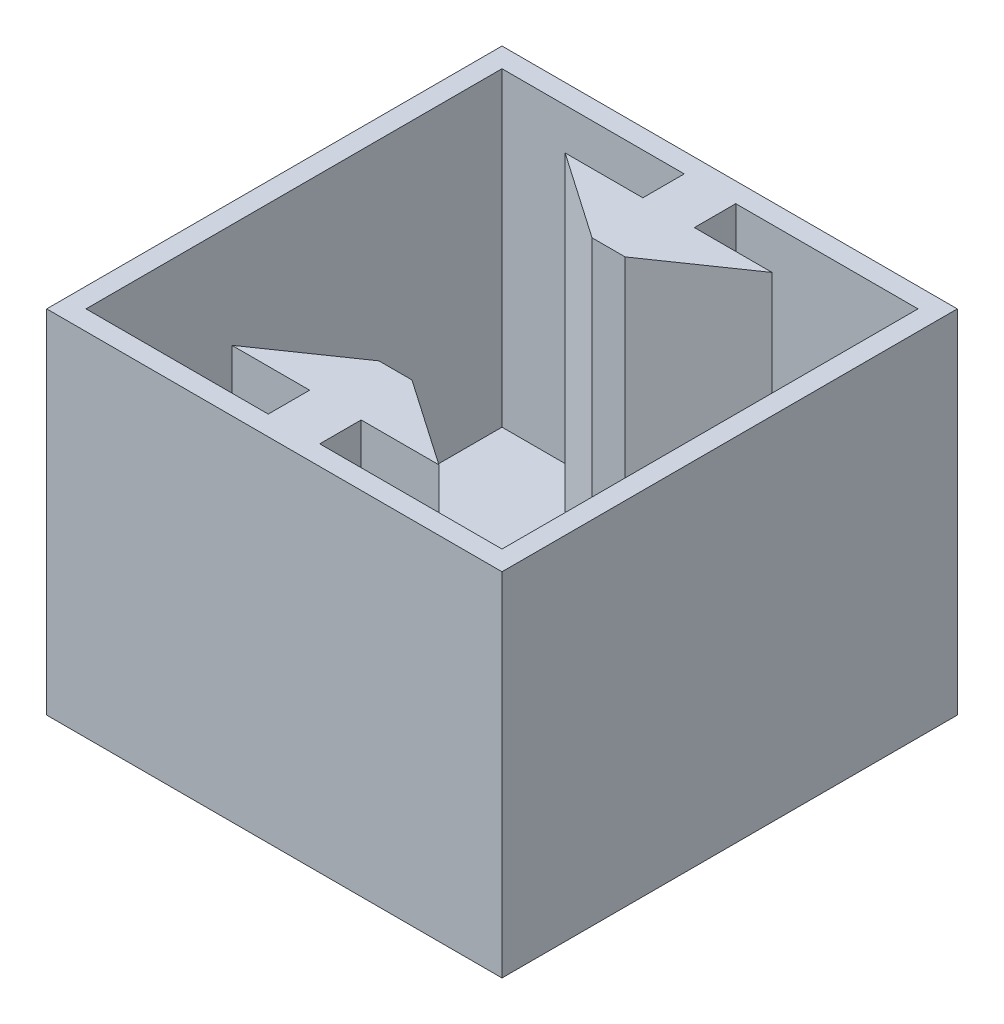
ISO-10303-21;
HEADER;
FILE_DESCRIPTION(('STEP AP214'),'2;1');
FILE_NAME('part.step','',(''),(''),'','','');
FILE_SCHEMA(('AUTOMOTIVE_DESIGN { 1 0 10303 214 1 1 1 1 }'));
ENDSEC;
DATA;
#1=APPLICATION_CONTEXT('core data for automotive mechanical design processes');
#2=APPLICATION_PROTOCOL_DEFINITION('international standard','automotive_design',2000,#1);
#3=PRODUCT_CONTEXT('',#1,'mechanical');
#4=PRODUCT('Part','Part','',(#3));
#5=PRODUCT_RELATED_PRODUCT_CATEGORY('part','',(#4));
#6=PRODUCT_DEFINITION_FORMATION('','',#4);
#7=PRODUCT_DEFINITION_CONTEXT('part definition',#1,'design');
#8=PRODUCT_DEFINITION('design','',#6,#7);
#9=PRODUCT_DEFINITION_SHAPE('','',#8);
#10=(LENGTH_UNIT() NAMED_UNIT(*) SI_UNIT(.MILLI.,.METRE.));
#11=(NAMED_UNIT(*) PLANE_ANGLE_UNIT() SI_UNIT($,.RADIAN.));
#12=(NAMED_UNIT(*) SI_UNIT($,.STERADIAN.) SOLID_ANGLE_UNIT());
#13=UNCERTAINTY_MEASURE_WITH_UNIT(LENGTH_MEASURE(1.E-05),#10,'distance_accuracy_value','');
#14=(GEOMETRIC_REPRESENTATION_CONTEXT(3) GLOBAL_UNCERTAINTY_ASSIGNED_CONTEXT((#13)) GLOBAL_UNIT_ASSIGNED_CONTEXT((#10,
#11,#12)) REPRESENTATION_CONTEXT('',''));
#15=CARTESIAN_POINT('',(0.,0.,0.));
#16=DIRECTION('',(0.,0.,1.));
#17=DIRECTION('',(1.,0.,0.));
#18=AXIS2_PLACEMENT_3D('',#15,#16,#17);
#19=CARTESIAN_POINT('',(0.,15.,-10.05));
#20=DIRECTION('',(0.,0.,-1.));
#21=DIRECTION('',(-1.,0.,0.));
#22=AXIS2_PLACEMENT_3D('',#19,#20,#21);
#23=PLANE('',#22);
#24=DIRECTION('',(1.,0.,0.));
#25=VECTOR('',#24,1.);
#26=CARTESIAN_POINT('',(0.,0.,-10.05));
#27=LINE('',#26,#25);
#28=CARTESIAN_POINT('',(-10.05,0.,-10.05));
#29=VERTEX_POINT('',#28);
#30=CARTESIAN_POINT('',(-1.245,0.,-10.05));
#31=VERTEX_POINT('',#30);
#32=EDGE_CURVE('E264',#29,#31,#27,.T.);
#33=ORIENTED_EDGE('',*,*,#32,.T.);
#34=DIRECTION('',(0.,-1.,0.));
#35=VECTOR('',#34,1.);
#36=CARTESIAN_POINT('',(-1.245,15.,-10.05));
#37=LINE('',#36,#35);
#38=CARTESIAN_POINT('',(-1.245,15.,-10.05));
#39=VERTEX_POINT('',#38);
#40=EDGE_CURVE('E11',#39,#31,#37,.T.);
#41=ORIENTED_EDGE('',*,*,#40,.F.);
#42=DIRECTION('',(1.,0.,0.));
#43=VECTOR('',#42,1.);
#44=CARTESIAN_POINT('',(0.,15.,-10.05));
#45=LINE('',#44,#43);
#46=CARTESIAN_POINT('',(-10.05,15.,-10.05));
#47=VERTEX_POINT('',#46);
#48=EDGE_CURVE('E233',#47,#39,#45,.T.);
#49=ORIENTED_EDGE('',*,*,#48,.F.);
#50=DIRECTION('',(0.,-1.,0.));
#51=VECTOR('',#50,1.);
#52=CARTESIAN_POINT('',(-10.05,15.,-10.05));
#53=LINE('',#52,#51);
#54=EDGE_CURVE('E54',#47,#29,#53,.T.);
#55=ORIENTED_EDGE('',*,*,#54,.T.);
#56=EDGE_LOOP('',(#33,#41,#49,#55));
#57=FACE_BOUND('',#56,.T.);
#58=ADVANCED_FACE('F35',(#57),#23,.F.);
#59=CARTESIAN_POINT('',(-1.245,15.,0.));
#60=DIRECTION('',(-1.,0.,0.));
#61=DIRECTION('',(0.,0.,1.));
#62=AXIS2_PLACEMENT_3D('',#59,#60,#61);
#63=PLANE('',#62);
#64=DIRECTION('',(0.,0.,-1.));
#65=VECTOR('',#64,1.);
#66=CARTESIAN_POINT('',(-1.245,0.,0.));
#67=LINE('',#66,#65);
#68=CARTESIAN_POINT('',(-1.245,0.,-8.05));
#69=VERTEX_POINT('',#68);
#70=EDGE_CURVE('E380',#69,#31,#67,.T.);
#71=ORIENTED_EDGE('',*,*,#70,.F.);
#72=DIRECTION('',(0.,-1.,0.));
#73=VECTOR('',#72,1.);
#74=CARTESIAN_POINT('',(-1.245,15.,-8.05));
#75=LINE('',#74,#73);
#76=CARTESIAN_POINT('',(-1.245,15.,-8.05));
#77=VERTEX_POINT('',#76);
#78=EDGE_CURVE('E45',#77,#69,#75,.T.);
#79=ORIENTED_EDGE('',*,*,#78,.F.);
#80=DIRECTION('',(0.,0.,-1.));
#81=VECTOR('',#80,1.);
#82=CARTESIAN_POINT('',(-1.245,15.,0.));
#83=LINE('',#82,#81);
#84=EDGE_CURVE('E248',#77,#39,#83,.T.);
#85=ORIENTED_EDGE('',*,*,#84,.T.);
#86=ORIENTED_EDGE('',*,*,#40,.T.);
#87=EDGE_LOOP('',(#71,#79,#85,#86));
#88=FACE_BOUND('',#87,.T.);
#89=ADVANCED_FACE('F432',(#88),#63,.T.);
#90=CARTESIAN_POINT('',(0.,15.,-8.05));
#91=DIRECTION('',(0.,0.,-1.));
#92=DIRECTION('',(-1.,0.,0.));
#93=AXIS2_PLACEMENT_3D('',#90,#91,#92);
#94=PLANE('',#93);
#95=DIRECTION('',(1.,0.,0.));
#96=VECTOR('',#95,1.);
#97=CARTESIAN_POINT('',(0.,0.,-8.05));
#98=LINE('',#97,#96);
#99=CARTESIAN_POINT('',(-5.,0.,-8.05));
#100=VERTEX_POINT('',#99);
#101=EDGE_CURVE('E377',#100,#69,#98,.T.);
#102=ORIENTED_EDGE('',*,*,#101,.F.);
#103=DIRECTION('',(0.,-1.,0.));
#104=VECTOR('',#103,1.);
#105=CARTESIAN_POINT('',(-5.,15.,-8.05));
#106=LINE('',#105,#104);
#107=CARTESIAN_POINT('',(-5.,15.,-8.05));
#108=VERTEX_POINT('',#107);
#109=EDGE_CURVE('E302',#108,#100,#106,.T.);
#110=ORIENTED_EDGE('',*,*,#109,.F.);
#111=DIRECTION('',(1.,0.,0.));
#112=VECTOR('',#111,1.);
#113=CARTESIAN_POINT('',(0.,15.,-8.05));
#114=LINE('',#113,#112);
#115=EDGE_CURVE('E245',#108,#77,#114,.T.);
#116=ORIENTED_EDGE('',*,*,#115,.T.);
#117=ORIENTED_EDGE('',*,*,#78,.T.);
#118=EDGE_LOOP('',(#102,#110,#116,#117));
#119=FACE_BOUND('',#118,.T.);
#120=ADVANCED_FACE('F438',(#119),#94,.T.);
#121=CARTESIAN_POINT('',(2.14984977383399,15.,-3.11421897210364));
#122=DIRECTION('',(-0.568111213679344,0.,0.82295179013827));
#123=DIRECTION('',(0.82295179013827,0.,0.568111213679344));
#124=AXIS2_PLACEMENT_3D('',#121,#122,#123);
#125=PLANE('',#124);
#126=DIRECTION('',(-0.82295179013827,0.,-0.568111213679344));
#127=VECTOR('',#126,1.);
#128=CARTESIAN_POINT('',(2.14984977383399,0.,-3.11421897210364));
#129=LINE('',#128,#127);
#130=CARTESIAN_POINT('',(-0.799132046796712,0.,-5.15));
#131=VERTEX_POINT('',#130);
#132=EDGE_CURVE('E374',#131,#100,#129,.T.);
#133=ORIENTED_EDGE('',*,*,#132,.F.);
#134=DIRECTION('',(0.,-1.,0.));
#135=VECTOR('',#134,1.);
#136=CARTESIAN_POINT('',(-0.799132046796712,15.,-5.15));
#137=LINE('',#136,#135);
#138=CARTESIAN_POINT('',(-0.799132046796712,15.,-5.15));
#139=VERTEX_POINT('',#138);
#140=EDGE_CURVE('E304',#139,#131,#137,.T.);
#141=ORIENTED_EDGE('',*,*,#140,.F.);
#142=DIRECTION('',(-0.82295179013827,0.,-0.568111213679344));
#143=VECTOR('',#142,1.);
#144=CARTESIAN_POINT('',(2.14984977383399,15.,-3.11421897210364));
#145=LINE('',#144,#143);
#146=EDGE_CURVE('E242',#139,#108,#145,.T.);
#147=ORIENTED_EDGE('',*,*,#146,.T.);
#148=ORIENTED_EDGE('',*,*,#109,.T.);
#149=EDGE_LOOP('',(#133,#141,#147,#148));
#150=FACE_BOUND('',#149,.T.);
#151=ADVANCED_FACE('F496',(#150),#125,.T.);
#152=CARTESIAN_POINT('',(0.,15.,-5.15));
#153=DIRECTION('',(0.,0.,-1.));
#154=DIRECTION('',(-1.,0.,0.));
#155=AXIS2_PLACEMENT_3D('',#152,#153,#154);
#156=PLANE('',#155);
#157=DIRECTION('',(1.,0.,0.));
#158=VECTOR('',#157,1.);
#159=CARTESIAN_POINT('',(0.,0.,-5.15));
#160=LINE('',#159,#158);
#161=CARTESIAN_POINT('',(0.799132046796712,0.,-5.15));
#162=VERTEX_POINT('',#161);
#163=EDGE_CURVE('E372',#131,#162,#160,.T.);
#164=ORIENTED_EDGE('',*,*,#163,.T.);
#165=DIRECTION('',(0.,-1.,0.));
#166=VECTOR('',#165,1.);
#167=CARTESIAN_POINT('',(0.799132046796712,15.,-5.15));
#168=LINE('',#167,#166);
#169=CARTESIAN_POINT('',(0.799132046796712,15.,-5.15));
#170=VERTEX_POINT('',#169);
#171=EDGE_CURVE('E306',#170,#162,#168,.T.);
#172=ORIENTED_EDGE('',*,*,#171,.F.);
#173=DIRECTION('',(1.,0.,0.));
#174=VECTOR('',#173,1.);
#175=CARTESIAN_POINT('',(0.,15.,-5.15));
#176=LINE('',#175,#174);
#177=EDGE_CURVE('E240',#139,#170,#176,.T.);
#178=ORIENTED_EDGE('',*,*,#177,.F.);
#179=ORIENTED_EDGE('',*,*,#140,.T.);
#180=EDGE_LOOP('',(#164,#172,#178,#179));
#181=FACE_BOUND('',#180,.T.);
#182=ADVANCED_FACE('F500',(#181),#156,.F.);
#183=CARTESIAN_POINT('',(-2.14984977383399,15.,-3.11421897210364));
#184=DIRECTION('',(-0.568111213679344,0.,-0.82295179013827));
#185=DIRECTION('',(-0.82295179013827,0.,0.568111213679344));
#186=AXIS2_PLACEMENT_3D('',#183,#184,#185);
#187=PLANE('',#186);
#188=DIRECTION('',(0.82295179013827,0.,-0.568111213679344));
#189=VECTOR('',#188,1.);
#190=CARTESIAN_POINT('',(-2.14984977383399,0.,-3.11421897210364));
#191=LINE('',#190,#189);
#192=CARTESIAN_POINT('',(5.,0.,-8.05));
#193=VERTEX_POINT('',#192);
#194=EDGE_CURVE('E370',#162,#193,#191,.T.);
#195=ORIENTED_EDGE('',*,*,#194,.T.);
#196=DIRECTION('',(0.,-1.,0.));
#197=VECTOR('',#196,1.);
#198=CARTESIAN_POINT('',(5.,15.,-8.05));
#199=LINE('',#198,#197);
#200=CARTESIAN_POINT('',(5.,15.,-8.05));
#201=VERTEX_POINT('',#200);
#202=EDGE_CURVE('E309',#201,#193,#199,.T.);
#203=ORIENTED_EDGE('',*,*,#202,.F.);
#204=DIRECTION('',(0.82295179013827,0.,-0.568111213679344));
#205=VECTOR('',#204,1.);
#206=CARTESIAN_POINT('',(-2.14984977383399,15.,-3.11421897210364));
#207=LINE('',#206,#205);
#208=EDGE_CURVE('E238',#170,#201,#207,.T.);
#209=ORIENTED_EDGE('',*,*,#208,.F.);
#210=ORIENTED_EDGE('',*,*,#171,.T.);
#211=EDGE_LOOP('',(#195,#203,#209,#210));
#212=FACE_BOUND('',#211,.T.);
#213=ADVANCED_FACE('F504',(#212),#187,.F.);
#214=CARTESIAN_POINT('',(0.,15.,-8.05));
#215=DIRECTION('',(0.,0.,1.));
#216=DIRECTION('',(1.,0.,0.));
#217=AXIS2_PLACEMENT_3D('',#214,#215,#216);
#218=PLANE('',#217);
#219=DIRECTION('',(-1.,0.,0.));
#220=VECTOR('',#219,1.);
#221=CARTESIAN_POINT('',(0.,0.,-8.05));
#222=LINE('',#221,#220);
#223=CARTESIAN_POINT('',(1.245,0.,-8.05));
#224=VERTEX_POINT('',#223);
#225=EDGE_CURVE('E368',#193,#224,#222,.T.);
#226=ORIENTED_EDGE('',*,*,#225,.T.);
#227=DIRECTION('',(0.,-1.,0.));
#228=VECTOR('',#227,1.);
#229=CARTESIAN_POINT('',(1.245,15.,-8.05));
#230=LINE('',#229,#228);
#231=CARTESIAN_POINT('',(1.245,15.,-8.05));
#232=VERTEX_POINT('',#231);
#233=EDGE_CURVE('E312',#232,#224,#230,.T.);
#234=ORIENTED_EDGE('',*,*,#233,.F.);
#235=DIRECTION('',(-1.,0.,0.));
#236=VECTOR('',#235,1.);
#237=CARTESIAN_POINT('',(0.,15.,-8.05));
#238=LINE('',#237,#236);
#239=EDGE_CURVE('E236',#201,#232,#238,.T.);
#240=ORIENTED_EDGE('',*,*,#239,.F.);
#241=ORIENTED_EDGE('',*,*,#202,.T.);
#242=EDGE_LOOP('',(#226,#234,#240,#241));
#243=FACE_BOUND('',#242,.T.);
#244=ADVANCED_FACE('F453',(#243),#218,.F.);
#245=CARTESIAN_POINT('',(1.245,15.,0.));
#246=DIRECTION('',(-1.,0.,0.));
#247=DIRECTION('',(0.,0.,1.));
#248=AXIS2_PLACEMENT_3D('',#245,#246,#247);
#249=PLANE('',#248);
#250=DIRECTION('',(0.,0.,-1.));
#251=VECTOR('',#250,1.);
#252=CARTESIAN_POINT('',(1.245,0.,0.));
#253=LINE('',#252,#251);
#254=CARTESIAN_POINT('',(1.245,0.,-10.05));
#255=VERTEX_POINT('',#254);
#256=EDGE_CURVE('E366',#224,#255,#253,.T.);
#257=ORIENTED_EDGE('',*,*,#256,.T.);
#258=DIRECTION('',(0.,-1.,0.));
#259=VECTOR('',#258,1.);
#260=CARTESIAN_POINT('',(1.245,15.,-10.05));
#261=LINE('',#260,#259);
#262=CARTESIAN_POINT('',(1.245,15.,-10.05));
#263=VERTEX_POINT('',#262);
#264=EDGE_CURVE('E315',#263,#255,#261,.T.);
#265=ORIENTED_EDGE('',*,*,#264,.F.);
#266=DIRECTION('',(0.,0.,-1.));
#267=VECTOR('',#266,1.);
#268=CARTESIAN_POINT('',(1.245,15.,0.));
#269=LINE('',#268,#267);
#270=EDGE_CURVE('E231',#232,#263,#269,.T.);
#271=ORIENTED_EDGE('',*,*,#270,.F.);
#272=ORIENTED_EDGE('',*,*,#233,.T.);
#273=EDGE_LOOP('',(#257,#265,#271,#272));
#274=FACE_BOUND('',#273,.T.);
#275=ADVANCED_FACE('F445',(#274),#249,.F.);
#276=CARTESIAN_POINT('',(10.05,0.,-10.05));
#277=VERTEX_POINT('',#276);
#278=EDGE_CURVE('E365',#255,#277,#27,.T.);
#279=ORIENTED_EDGE('',*,*,#278,.T.);
#280=DIRECTION('',(0.,-1.,0.));
#281=VECTOR('',#280,1.);
#282=CARTESIAN_POINT('',(10.05,15.,-10.05));
#283=LINE('',#282,#281);
#284=CARTESIAN_POINT('',(10.05,15.,-10.05));
#285=VERTEX_POINT('',#284);
#286=EDGE_CURVE('E318',#285,#277,#283,.T.);
#287=ORIENTED_EDGE('',*,*,#286,.F.);
#288=EDGE_CURVE('E228',#263,#285,#45,.T.);
#289=ORIENTED_EDGE('',*,*,#288,.F.);
#290=ORIENTED_EDGE('',*,*,#264,.T.);
#291=EDGE_LOOP('',(#279,#287,#289,#290));
#292=FACE_BOUND('',#291,.T.);
#293=ADVANCED_FACE('F434',(#292),#23,.F.);
#294=CARTESIAN_POINT('',(10.05,15.,0.));
#295=DIRECTION('',(1.,0.,0.));
#296=DIRECTION('',(0.,0.,-1.));
#297=AXIS2_PLACEMENT_3D('',#294,#295,#296);
#298=PLANE('',#297);
#299=DIRECTION('',(0.,0.,1.));
#300=VECTOR('',#299,1.);
#301=CARTESIAN_POINT('',(10.05,0.,0.));
#302=LINE('',#301,#300);
#303=CARTESIAN_POINT('',(10.05,0.,10.05));
#304=VERTEX_POINT('',#303);
#305=EDGE_CURVE('E362',#277,#304,#302,.T.);
#306=ORIENTED_EDGE('',*,*,#305,.T.);
#307=DIRECTION('',(0.,-1.,0.));
#308=VECTOR('',#307,1.);
#309=CARTESIAN_POINT('',(10.05,15.,10.05));
#310=LINE('',#309,#308);
#311=CARTESIAN_POINT('',(10.05,15.,10.05));
#312=VERTEX_POINT('',#311);
#313=EDGE_CURVE('E321',#312,#304,#310,.T.);
#314=ORIENTED_EDGE('',*,*,#313,.F.);
#315=DIRECTION('',(0.,0.,1.));
#316=VECTOR('',#315,1.);
#317=CARTESIAN_POINT('',(10.05,15.,0.));
#318=LINE('',#317,#316);
#319=EDGE_CURVE('E223',#285,#312,#318,.T.);
#320=ORIENTED_EDGE('',*,*,#319,.F.);
#321=ORIENTED_EDGE('',*,*,#286,.T.);
#322=EDGE_LOOP('',(#306,#314,#320,#321));
#323=FACE_BOUND('',#322,.T.);
#324=ADVANCED_FACE('F444',(#323),#298,.F.);
#325=CARTESIAN_POINT('',(0.,15.,10.05));
#326=DIRECTION('',(0.,0.,-1.));
#327=DIRECTION('',(-1.,0.,0.));
#328=AXIS2_PLACEMENT_3D('',#325,#326,#327);
#329=PLANE('',#328);
#330=DIRECTION('',(1.,0.,0.));
#331=VECTOR('',#330,1.);
#332=CARTESIAN_POINT('',(0.,0.,10.05));
#333=LINE('',#332,#331);
#334=CARTESIAN_POINT('',(1.245,0.,10.05));
#335=VERTEX_POINT('',#334);
#336=EDGE_CURVE('E359',#335,#304,#333,.T.);
#337=ORIENTED_EDGE('',*,*,#336,.F.);
#338=DIRECTION('',(0.,-1.,0.));
#339=VECTOR('',#338,1.);
#340=CARTESIAN_POINT('',(1.245,15.,10.05));
#341=LINE('',#340,#339);
#342=CARTESIAN_POINT('',(1.245,15.,10.05));
#343=VERTEX_POINT('',#342);
#344=EDGE_CURVE('E323',#343,#335,#341,.T.);
#345=ORIENTED_EDGE('',*,*,#344,.F.);
#346=DIRECTION('',(1.,0.,0.));
#347=VECTOR('',#346,1.);
#348=CARTESIAN_POINT('',(0.,15.,10.05));
#349=LINE('',#348,#347);
#350=EDGE_CURVE('E216',#343,#312,#349,.T.);
#351=ORIENTED_EDGE('',*,*,#350,.T.);
#352=ORIENTED_EDGE('',*,*,#313,.T.);
#353=EDGE_LOOP('',(#337,#345,#351,#352));
#354=FACE_BOUND('',#353,.T.);
#355=ADVANCED_FACE('F451',(#354),#329,.T.);
#356=CARTESIAN_POINT('',(1.245,15.,0.));
#357=DIRECTION('',(1.,0.,0.));
#358=DIRECTION('',(0.,0.,-1.));
#359=AXIS2_PLACEMENT_3D('',#356,#357,#358);
#360=PLANE('',#359);
#361=DIRECTION('',(0.,0.,1.));
#362=VECTOR('',#361,1.);
#363=CARTESIAN_POINT('',(1.245,0.,0.));
#364=LINE('',#363,#362);
#365=CARTESIAN_POINT('',(1.245,0.,8.05));
#366=VERTEX_POINT('',#365);
#367=EDGE_CURVE('E356',#366,#335,#364,.T.);
#368=ORIENTED_EDGE('',*,*,#367,.F.);
#369=DIRECTION('',(0.,-1.,0.));
#370=VECTOR('',#369,1.);
#371=CARTESIAN_POINT('',(1.245,15.,8.05));
#372=LINE('',#371,#370);
#373=CARTESIAN_POINT('',(1.245,15.,8.05));
#374=VERTEX_POINT('',#373);
#375=EDGE_CURVE('E325',#374,#366,#372,.T.);
#376=ORIENTED_EDGE('',*,*,#375,.F.);
#377=DIRECTION('',(0.,0.,1.));
#378=VECTOR('',#377,1.);
#379=CARTESIAN_POINT('',(1.245,15.,0.));
#380=LINE('',#379,#378);
#381=EDGE_CURVE('E222',#374,#343,#380,.T.);
#382=ORIENTED_EDGE('',*,*,#381,.T.);
#383=ORIENTED_EDGE('',*,*,#344,.T.);
#384=EDGE_LOOP('',(#368,#376,#382,#383));
#385=FACE_BOUND('',#384,.T.);
#386=ADVANCED_FACE('F463',(#385),#360,.T.);
#387=CARTESIAN_POINT('',(0.,15.,8.05));
#388=DIRECTION('',(0.,0.,1.));
#389=DIRECTION('',(1.,0.,0.));
#390=AXIS2_PLACEMENT_3D('',#387,#388,#389);
#391=PLANE('',#390);
#392=DIRECTION('',(-1.,0.,0.));
#393=VECTOR('',#392,1.);
#394=CARTESIAN_POINT('',(0.,0.,8.05));
#395=LINE('',#394,#393);
#396=CARTESIAN_POINT('',(5.,0.,8.05));
#397=VERTEX_POINT('',#396);
#398=EDGE_CURVE('E353',#397,#366,#395,.T.);
#399=ORIENTED_EDGE('',*,*,#398,.F.);
#400=DIRECTION('',(0.,-1.,0.));
#401=VECTOR('',#400,1.);
#402=CARTESIAN_POINT('',(5.,15.,8.05));
#403=LINE('',#402,#401);
#404=CARTESIAN_POINT('',(5.,15.,8.05));
#405=VERTEX_POINT('',#404);
#406=EDGE_CURVE('E327',#405,#397,#403,.T.);
#407=ORIENTED_EDGE('',*,*,#406,.F.);
#408=DIRECTION('',(-1.,0.,0.));
#409=VECTOR('',#408,1.);
#410=CARTESIAN_POINT('',(0.,15.,8.05));
#411=LINE('',#410,#409);
#412=EDGE_CURVE('E227',#405,#374,#411,.T.);
#413=ORIENTED_EDGE('',*,*,#412,.T.);
#414=ORIENTED_EDGE('',*,*,#375,.T.);
#415=EDGE_LOOP('',(#399,#407,#413,#414));
#416=FACE_BOUND('',#415,.T.);
#417=ADVANCED_FACE('F397',(#416),#391,.T.);
#418=CARTESIAN_POINT('',(-2.149849773834,15.,3.11421897210364));
#419=DIRECTION('',(0.568111213679345,0.,-0.822951790138269));
#420=DIRECTION('',(-0.822951790138269,0.,-0.568111213679345));
#421=AXIS2_PLACEMENT_3D('',#418,#419,#420);
#422=PLANE('',#421);
#423=DIRECTION('',(0.822951790138269,0.,0.568111213679345));
#424=VECTOR('',#423,1.);
#425=CARTESIAN_POINT('',(-2.149849773834,0.,3.11421897210364));
#426=LINE('',#425,#424);
#427=CARTESIAN_POINT('',(0.799132046796713,0.,5.15));
#428=VERTEX_POINT('',#427);
#429=EDGE_CURVE('E350',#428,#397,#426,.T.);
#430=ORIENTED_EDGE('',*,*,#429,.F.);
#431=DIRECTION('',(0.,-1.,0.));
#432=VECTOR('',#431,1.);
#433=CARTESIAN_POINT('',(0.799132046796713,15.,5.15));
#434=LINE('',#433,#432);
#435=CARTESIAN_POINT('',(0.799132046796713,15.,5.15));
#436=VERTEX_POINT('',#435);
#437=EDGE_CURVE('E329',#436,#428,#434,.T.);
#438=ORIENTED_EDGE('',*,*,#437,.F.);
#439=DIRECTION('',(0.822951790138269,0.,0.568111213679345));
#440=VECTOR('',#439,1.);
#441=CARTESIAN_POINT('',(-2.149849773834,15.,3.11421897210364));
#442=LINE('',#441,#440);
#443=EDGE_CURVE('E390',#436,#405,#442,.T.);
#444=ORIENTED_EDGE('',*,*,#443,.T.);
#445=ORIENTED_EDGE('',*,*,#406,.T.);
#446=EDGE_LOOP('',(#430,#438,#444,#445));
#447=FACE_BOUND('',#446,.T.);
#448=ADVANCED_FACE('F404',(#447),#422,.T.);
#449=CARTESIAN_POINT('',(0.,15.,5.15));
#450=DIRECTION('',(0.,0.,-1.));
#451=DIRECTION('',(-1.,0.,0.));
#452=AXIS2_PLACEMENT_3D('',#449,#450,#451);
#453=PLANE('',#452);
#454=DIRECTION('',(1.,0.,0.));
#455=VECTOR('',#454,1.);
#456=CARTESIAN_POINT('',(0.,0.,5.15));
#457=LINE('',#456,#455);
#458=CARTESIAN_POINT('',(-0.799132046796713,0.,5.15));
#459=VERTEX_POINT('',#458);
#460=EDGE_CURVE('E347',#459,#428,#457,.T.);
#461=ORIENTED_EDGE('',*,*,#460,.F.);
#462=DIRECTION('',(0.,-1.,0.));
#463=VECTOR('',#462,1.);
#464=CARTESIAN_POINT('',(-0.799132046796713,15.,5.15));
#465=LINE('',#464,#463);
#466=CARTESIAN_POINT('',(-0.799132046796713,15.,5.15));
#467=VERTEX_POINT('',#466);
#468=EDGE_CURVE('E331',#467,#459,#465,.T.);
#469=ORIENTED_EDGE('',*,*,#468,.F.);
#470=DIRECTION('',(1.,0.,0.));
#471=VECTOR('',#470,1.);
#472=CARTESIAN_POINT('',(0.,15.,5.15));
#473=LINE('',#472,#471);
#474=EDGE_CURVE('E387',#467,#436,#473,.T.);
#475=ORIENTED_EDGE('',*,*,#474,.T.);
#476=ORIENTED_EDGE('',*,*,#437,.T.);
#477=EDGE_LOOP('',(#461,#469,#475,#476));
#478=FACE_BOUND('',#477,.T.);
#479=ADVANCED_FACE('F407',(#478),#453,.T.);
#480=CARTESIAN_POINT('',(2.149849773834,15.,3.11421897210364));
#481=DIRECTION('',(0.568111213679345,0.,0.822951790138269));
#482=DIRECTION('',(0.822951790138269,0.,-0.568111213679345));
#483=AXIS2_PLACEMENT_3D('',#480,#481,#482);
#484=PLANE('',#483);
#485=DIRECTION('',(-0.822951790138269,0.,0.568111213679345));
#486=VECTOR('',#485,1.);
#487=CARTESIAN_POINT('',(2.149849773834,0.,3.11421897210364));
#488=LINE('',#487,#486);
#489=CARTESIAN_POINT('',(-5.,0.,8.05));
#490=VERTEX_POINT('',#489);
#491=EDGE_CURVE('E345',#459,#490,#488,.T.);
#492=ORIENTED_EDGE('',*,*,#491,.T.);
#493=DIRECTION('',(0.,-1.,0.));
#494=VECTOR('',#493,1.);
#495=CARTESIAN_POINT('',(-5.,15.,8.05));
#496=LINE('',#495,#494);
#497=CARTESIAN_POINT('',(-5.,15.,8.05));
#498=VERTEX_POINT('',#497);
#499=EDGE_CURVE('E333',#498,#490,#496,.T.);
#500=ORIENTED_EDGE('',*,*,#499,.F.);
#501=DIRECTION('',(-0.822951790138269,0.,0.568111213679345));
#502=VECTOR('',#501,1.);
#503=CARTESIAN_POINT('',(2.149849773834,15.,3.11421897210364));
#504=LINE('',#503,#502);
#505=EDGE_CURVE('E385',#467,#498,#504,.T.);
#506=ORIENTED_EDGE('',*,*,#505,.F.);
#507=ORIENTED_EDGE('',*,*,#468,.T.);
#508=EDGE_LOOP('',(#492,#500,#506,#507));
#509=FACE_BOUND('',#508,.T.);
#510=ADVANCED_FACE('F412',(#509),#484,.F.);
#511=CARTESIAN_POINT('',(0.,15.,8.05));
#512=DIRECTION('',(0.,0.,-1.));
#513=DIRECTION('',(-1.,0.,0.));
#514=AXIS2_PLACEMENT_3D('',#511,#512,#513);
#515=PLANE('',#514);
#516=DIRECTION('',(1.,0.,0.));
#517=VECTOR('',#516,1.);
#518=CARTESIAN_POINT('',(0.,0.,8.05));
#519=LINE('',#518,#517);
#520=CARTESIAN_POINT('',(-1.245,0.,8.05));
#521=VERTEX_POINT('',#520);
#522=EDGE_CURVE('E343',#490,#521,#519,.T.);
#523=ORIENTED_EDGE('',*,*,#522,.T.);
#524=DIRECTION('',(0.,-1.,0.));
#525=VECTOR('',#524,1.);
#526=CARTESIAN_POINT('',(-1.245,15.,8.05));
#527=LINE('',#526,#525);
#528=CARTESIAN_POINT('',(-1.245,15.,8.05));
#529=VERTEX_POINT('',#528);
#530=EDGE_CURVE('E211',#529,#521,#527,.T.);
#531=ORIENTED_EDGE('',*,*,#530,.F.);
#532=DIRECTION('',(1.,0.,0.));
#533=VECTOR('',#532,1.);
#534=CARTESIAN_POINT('',(0.,15.,8.05));
#535=LINE('',#534,#533);
#536=EDGE_CURVE('E199',#498,#529,#535,.T.);
#537=ORIENTED_EDGE('',*,*,#536,.F.);
#538=ORIENTED_EDGE('',*,*,#499,.T.);
#539=EDGE_LOOP('',(#523,#531,#537,#538));
#540=FACE_BOUND('',#539,.T.);
#541=ADVANCED_FACE('F415',(#540),#515,.F.);
#542=CARTESIAN_POINT('',(-1.245,15.,0.));
#543=DIRECTION('',(1.,0.,0.));
#544=DIRECTION('',(0.,0.,-1.));
#545=AXIS2_PLACEMENT_3D('',#542,#543,#544);
#546=PLANE('',#545);
#547=DIRECTION('',(0.,0.,1.));
#548=VECTOR('',#547,1.);
#549=CARTESIAN_POINT('',(-1.245,0.,0.));
#550=LINE('',#549,#548);
#551=CARTESIAN_POINT('',(-1.245,0.,10.05));
#552=VERTEX_POINT('',#551);
#553=EDGE_CURVE('E208',#521,#552,#550,.T.);
#554=ORIENTED_EDGE('',*,*,#553,.T.);
#555=DIRECTION('',(0.,-1.,0.));
#556=VECTOR('',#555,1.);
#557=CARTESIAN_POINT('',(-1.245,15.,10.05));
#558=LINE('',#557,#556);
#559=CARTESIAN_POINT('',(-1.245,15.,10.05));
#560=VERTEX_POINT('',#559);
#561=EDGE_CURVE('E205',#560,#552,#558,.T.);
#562=ORIENTED_EDGE('',*,*,#561,.F.);
#563=DIRECTION('',(0.,0.,1.));
#564=VECTOR('',#563,1.);
#565=CARTESIAN_POINT('',(-1.245,15.,0.));
#566=LINE('',#565,#564);
#567=EDGE_CURVE('E192',#529,#560,#566,.T.);
#568=ORIENTED_EDGE('',*,*,#567,.F.);
#569=ORIENTED_EDGE('',*,*,#530,.T.);
#570=EDGE_LOOP('',(#554,#562,#568,#569));
#571=FACE_BOUND('',#570,.T.);
#572=ADVANCED_FACE('F206',(#571),#546,.F.);
#573=CARTESIAN_POINT('',(-10.05,0.,10.05));
#574=VERTEX_POINT('',#573);
#575=EDGE_CURVE('E341',#574,#552,#333,.T.);
#576=ORIENTED_EDGE('',*,*,#575,.F.);
#577=DIRECTION('',(0.,-1.,0.));
#578=VECTOR('',#577,1.);
#579=CARTESIAN_POINT('',(-10.05,15.,10.05));
#580=LINE('',#579,#578);
#581=CARTESIAN_POINT('',(-10.05,15.,10.05));
#582=VERTEX_POINT('',#581);
#583=EDGE_CURVE('E114',#582,#574,#580,.T.);
#584=ORIENTED_EDGE('',*,*,#583,.F.);
#585=EDGE_CURVE('E197',#582,#560,#349,.T.);
#586=ORIENTED_EDGE('',*,*,#585,.T.);
#587=ORIENTED_EDGE('',*,*,#561,.T.);
#588=EDGE_LOOP('',(#576,#584,#586,#587));
#589=FACE_BOUND('',#588,.T.);
#590=ADVANCED_FACE('F213',(#589),#329,.T.);
#591=CARTESIAN_POINT('',(11.,15.,0.));
#592=DIRECTION('',(1.,0.,0.));
#593=DIRECTION('',(0.,0.,-1.));
#594=AXIS2_PLACEMENT_3D('',#591,#592,#593);
#595=PLANE('',#594);
#596=DIRECTION('',(0.,-1.,0.));
#597=VECTOR('',#596,1.);
#598=CARTESIAN_POINT('',(11.,15.,11.));
#599=LINE('',#598,#597);
#600=CARTESIAN_POINT('',(11.,15.,11.));
#601=VERTEX_POINT('',#600);
#602=CARTESIAN_POINT('',(11.,-2.,11.));
#603=VERTEX_POINT('',#602);
#604=EDGE_CURVE('E217',#601,#603,#599,.T.);
#605=ORIENTED_EDGE('',*,*,#604,.T.);
#606=DIRECTION('',(0.,0.,1.));
#607=VECTOR('',#606,1.);
#608=CARTESIAN_POINT('',(11.,-2.,11.));
#609=LINE('',#608,#607);
#610=CARTESIAN_POINT('',(11.,-2.,-11.));
#611=VERTEX_POINT('',#610);
#612=EDGE_CURVE('E271',#611,#603,#609,.T.);
#613=ORIENTED_EDGE('',*,*,#612,.F.);
#614=DIRECTION('',(0.,-1.,0.));
#615=VECTOR('',#614,1.);
#616=CARTESIAN_POINT('',(11.,15.,-11.));
#617=LINE('',#616,#615);
#618=CARTESIAN_POINT('',(11.,15.,-11.));
#619=VERTEX_POINT('',#618);
#620=EDGE_CURVE('E39',#619,#611,#617,.T.);
#621=ORIENTED_EDGE('',*,*,#620,.F.);
#622=DIRECTION('',(0.,0.,1.));
#623=VECTOR('',#622,1.);
#624=CARTESIAN_POINT('',(11.,15.,0.));
#625=LINE('',#624,#623);
#626=EDGE_CURVE('E258',#619,#601,#625,.T.);
#627=ORIENTED_EDGE('',*,*,#626,.T.);
#628=EDGE_LOOP('',(#605,#613,#621,#627));
#629=FACE_BOUND('',#628,.T.);
#630=ADVANCED_FACE('F37',(#629),#595,.T.);
#631=CARTESIAN_POINT('',(0.,15.,-11.));
#632=DIRECTION('',(0.,0.,-1.));
#633=DIRECTION('',(-1.,0.,0.));
#634=AXIS2_PLACEMENT_3D('',#631,#632,#633);
#635=PLANE('',#634);
#636=ORIENTED_EDGE('',*,*,#620,.T.);
#637=DIRECTION('',(1.,0.,0.));
#638=VECTOR('',#637,1.);
#639=CARTESIAN_POINT('',(-11.,-2.,-11.));
#640=LINE('',#639,#638);
#641=CARTESIAN_POINT('',(-11.,-2.,-11.));
#642=VERTEX_POINT('',#641);
#643=EDGE_CURVE('E261',#642,#611,#640,.T.);
#644=ORIENTED_EDGE('',*,*,#643,.F.);
#645=DIRECTION('',(0.,-1.,0.));
#646=VECTOR('',#645,1.);
#647=CARTESIAN_POINT('',(-11.,15.,-11.));
#648=LINE('',#647,#646);
#649=CARTESIAN_POINT('',(-11.,15.,-11.));
#650=VERTEX_POINT('',#649);
#651=EDGE_CURVE('E297',#650,#642,#648,.T.);
#652=ORIENTED_EDGE('',*,*,#651,.F.);
#653=DIRECTION('',(1.,0.,0.));
#654=VECTOR('',#653,1.);
#655=CARTESIAN_POINT('',(0.,15.,-11.));
#656=LINE('',#655,#654);
#657=EDGE_CURVE('E255',#650,#619,#656,.T.);
#658=ORIENTED_EDGE('',*,*,#657,.T.);
#659=EDGE_LOOP('',(#636,#644,#652,#658));
#660=FACE_BOUND('',#659,.T.);
#661=ADVANCED_FACE('F485',(#660),#635,.T.);
#662=CARTESIAN_POINT('',(-11.,15.,0.));
#663=DIRECTION('',(1.,0.,0.));
#664=DIRECTION('',(0.,0.,-1.));
#665=AXIS2_PLACEMENT_3D('',#662,#663,#664);
#666=PLANE('',#665);
#667=ORIENTED_EDGE('',*,*,#651,.T.);
#668=DIRECTION('',(0.,0.,-1.));
#669=VECTOR('',#668,1.);
#670=CARTESIAN_POINT('',(-11.,-2.,11.));
#671=LINE('',#670,#669);
#672=CARTESIAN_POINT('',(-11.,-2.,11.));
#673=VERTEX_POINT('',#672);
#674=EDGE_CURVE('E265',#673,#642,#671,.T.);
#675=ORIENTED_EDGE('',*,*,#674,.F.);
#676=DIRECTION('',(0.,-1.,0.));
#677=VECTOR('',#676,1.);
#678=CARTESIAN_POINT('',(-11.,15.,11.));
#679=LINE('',#678,#677);
#680=CARTESIAN_POINT('',(-11.,15.,11.));
#681=VERTEX_POINT('',#680);
#682=EDGE_CURVE('E293',#681,#673,#679,.T.);
#683=ORIENTED_EDGE('',*,*,#682,.F.);
#684=DIRECTION('',(0.,0.,1.));
#685=VECTOR('',#684,1.);
#686=CARTESIAN_POINT('',(-11.,15.,0.));
#687=LINE('',#686,#685);
#688=EDGE_CURVE('E253',#650,#681,#687,.T.);
#689=ORIENTED_EDGE('',*,*,#688,.F.);
#690=EDGE_LOOP('',(#667,#675,#683,#689));
#691=FACE_BOUND('',#690,.T.);
#692=ADVANCED_FACE('F428',(#691),#666,.F.);
#693=CARTESIAN_POINT('',(0.,15.,11.));
#694=DIRECTION('',(0.,0.,-1.));
#695=DIRECTION('',(-1.,0.,0.));
#696=AXIS2_PLACEMENT_3D('',#693,#694,#695);
#697=PLANE('',#696);
#698=ORIENTED_EDGE('',*,*,#682,.T.);
#699=DIRECTION('',(-1.,0.,0.));
#700=VECTOR('',#699,1.);
#701=CARTESIAN_POINT('',(-11.,-2.,11.));
#702=LINE('',#701,#700);
#703=EDGE_CURVE('E268',#603,#673,#702,.T.);
#704=ORIENTED_EDGE('',*,*,#703,.F.);
#705=ORIENTED_EDGE('',*,*,#604,.F.);
#706=DIRECTION('',(1.,0.,0.));
#707=VECTOR('',#706,1.);
#708=CARTESIAN_POINT('',(0.,15.,11.));
#709=LINE('',#708,#707);
#710=EDGE_CURVE('E251',#681,#601,#709,.T.);
#711=ORIENTED_EDGE('',*,*,#710,.F.);
#712=EDGE_LOOP('',(#698,#704,#705,#711));
#713=FACE_BOUND('',#712,.T.);
#714=ADVANCED_FACE('F294',(#713),#697,.F.);
#715=CARTESIAN_POINT('',(-10.05,15.,0.));
#716=DIRECTION('',(1.,0.,0.));
#717=DIRECTION('',(0.,0.,-1.));
#718=AXIS2_PLACEMENT_3D('',#715,#716,#717);
#719=PLANE('',#718);
#720=DIRECTION('',(0.,0.,1.));
#721=VECTOR('',#720,1.);
#722=CARTESIAN_POINT('',(-10.05,0.,0.));
#723=LINE('',#722,#721);
#724=EDGE_CURVE('E260',#29,#574,#723,.T.);
#725=ORIENTED_EDGE('',*,*,#724,.F.);
#726=ORIENTED_EDGE('',*,*,#54,.F.);
#727=DIRECTION('',(0.,0.,1.));
#728=VECTOR('',#727,1.);
#729=CARTESIAN_POINT('',(-10.05,15.,0.));
#730=LINE('',#729,#728);
#731=EDGE_CURVE('E214',#47,#582,#730,.T.);
#732=ORIENTED_EDGE('',*,*,#731,.T.);
#733=ORIENTED_EDGE('',*,*,#583,.T.);
#734=EDGE_LOOP('',(#725,#726,#732,#733));
#735=FACE_BOUND('',#734,.T.);
#736=ADVANCED_FACE('F419',(#735),#719,.T.);
#737=CARTESIAN_POINT('',(0.,15.,0.));
#738=DIRECTION('',(0.,1.,0.));
#739=DIRECTION('',(0.,0.,1.));
#740=AXIS2_PLACEMENT_3D('',#737,#738,#739);
#741=PLANE('',#740);
#742=ORIENTED_EDGE('',*,*,#626,.F.);
#743=ORIENTED_EDGE('',*,*,#657,.F.);
#744=ORIENTED_EDGE('',*,*,#688,.T.);
#745=ORIENTED_EDGE('',*,*,#710,.T.);
#746=EDGE_LOOP('',(#742,#743,#744,#745));
#747=FACE_BOUND('',#746,.T.);
#748=ORIENTED_EDGE('',*,*,#48,.T.);
#749=ORIENTED_EDGE('',*,*,#84,.F.);
#750=ORIENTED_EDGE('',*,*,#115,.F.);
#751=ORIENTED_EDGE('',*,*,#146,.F.);
#752=ORIENTED_EDGE('',*,*,#177,.T.);
#753=ORIENTED_EDGE('',*,*,#208,.T.);
#754=ORIENTED_EDGE('',*,*,#239,.T.);
#755=ORIENTED_EDGE('',*,*,#270,.T.);
#756=ORIENTED_EDGE('',*,*,#288,.T.);
#757=ORIENTED_EDGE('',*,*,#319,.T.);
#758=ORIENTED_EDGE('',*,*,#350,.F.);
#759=ORIENTED_EDGE('',*,*,#381,.F.);
#760=ORIENTED_EDGE('',*,*,#412,.F.);
#761=ORIENTED_EDGE('',*,*,#443,.F.);
#762=ORIENTED_EDGE('',*,*,#474,.F.);
#763=ORIENTED_EDGE('',*,*,#505,.T.);
#764=ORIENTED_EDGE('',*,*,#536,.T.);
#765=ORIENTED_EDGE('',*,*,#567,.T.);
#766=ORIENTED_EDGE('',*,*,#585,.F.);
#767=ORIENTED_EDGE('',*,*,#731,.F.);
#768=EDGE_LOOP('',(#748,#749,#750,#751,#752,#753,#754,#755,#756,#757,#758,#759,#760,#761,#762,
#763,#764,#765,#766,#767));
#769=FACE_BOUND('',#768,.T.);
#770=ADVANCED_FACE('F194',(#747,#769),#741,.T.);
#771=CARTESIAN_POINT('',(0.,0.,0.));
#772=DIRECTION('',(0.,-1.,0.));
#773=DIRECTION('',(0.,0.,-1.));
#774=AXIS2_PLACEMENT_3D('',#771,#772,#773);
#775=PLANE('',#774);
#776=ORIENTED_EDGE('',*,*,#32,.F.);
#777=ORIENTED_EDGE('',*,*,#724,.T.);
#778=ORIENTED_EDGE('',*,*,#575,.T.);
#779=ORIENTED_EDGE('',*,*,#553,.F.);
#780=ORIENTED_EDGE('',*,*,#522,.F.);
#781=ORIENTED_EDGE('',*,*,#491,.F.);
#782=ORIENTED_EDGE('',*,*,#460,.T.);
#783=ORIENTED_EDGE('',*,*,#429,.T.);
#784=ORIENTED_EDGE('',*,*,#398,.T.);
#785=ORIENTED_EDGE('',*,*,#367,.T.);
#786=ORIENTED_EDGE('',*,*,#336,.T.);
#787=ORIENTED_EDGE('',*,*,#305,.F.);
#788=ORIENTED_EDGE('',*,*,#278,.F.);
#789=ORIENTED_EDGE('',*,*,#256,.F.);
#790=ORIENTED_EDGE('',*,*,#225,.F.);
#791=ORIENTED_EDGE('',*,*,#194,.F.);
#792=ORIENTED_EDGE('',*,*,#163,.F.);
#793=ORIENTED_EDGE('',*,*,#132,.T.);
#794=ORIENTED_EDGE('',*,*,#101,.T.);
#795=ORIENTED_EDGE('',*,*,#70,.T.);
#796=EDGE_LOOP('',(#776,#777,#778,#779,#780,#781,#782,#783,#784,#785,#786,#787,#788,#789,#790,
#791,#792,#793,#794,#795));
#797=FACE_BOUND('',#796,.T.);
#798=ADVANCED_FACE('F418',(#797),#775,.F.);
#799=CARTESIAN_POINT('',(0.,-2.,0.));
#800=DIRECTION('',(0.,-1.,0.));
#801=DIRECTION('',(0.,0.,-1.));
#802=AXIS2_PLACEMENT_3D('',#799,#800,#801);
#803=PLANE('',#802);
#804=ORIENTED_EDGE('',*,*,#612,.T.);
#805=ORIENTED_EDGE('',*,*,#703,.T.);
#806=ORIENTED_EDGE('',*,*,#674,.T.);
#807=ORIENTED_EDGE('',*,*,#643,.T.);
#808=EDGE_LOOP('',(#804,#805,#806,#807));
#809=FACE_BOUND('',#808,.T.);
#810=ADVANCED_FACE('F275',(#809),#803,.T.);
#811=CLOSED_SHELL('',(#58,#89,#120,#151,#182,#213,#244,#275,#293,#324,#355,#386,#417,#448,#479,
#510,#541,#572,#590,#630,#661,#692,#714,#736,#770,#798,#810));
#812=MANIFOLD_SOLID_BREP('B2',#811);
#813=ADVANCED_BREP_SHAPE_REPRESENTATION('',(#18,#812),#14);
#814=SHAPE_DEFINITION_REPRESENTATION(#9,#813);
ENDSEC;
END-ISO-10303-21;
